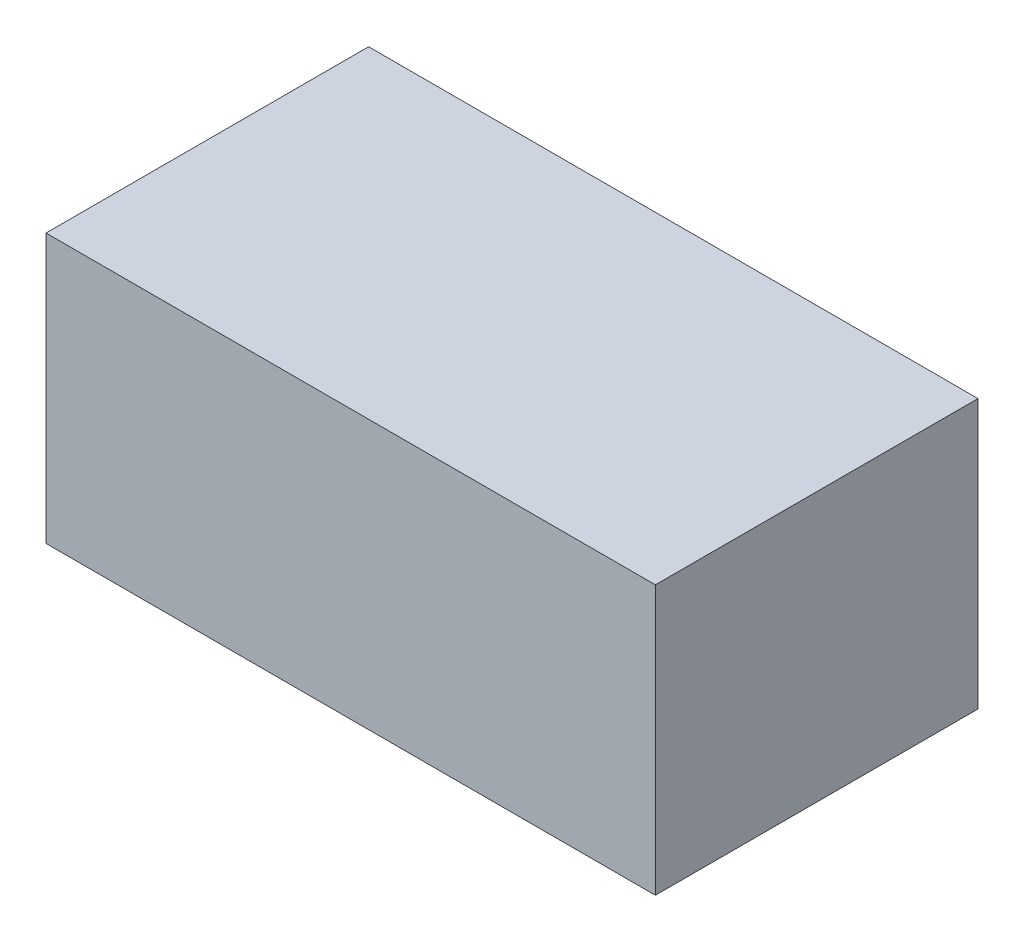
ISO-10303-21;
HEADER;
FILE_DESCRIPTION(('STEP AP214'),'2;1');
FILE_NAME('part.step','',(''),(''),'','','');
FILE_SCHEMA(('AUTOMOTIVE_DESIGN { 1 0 10303 214 1 1 1 1 }'));
ENDSEC;
DATA;
#1=APPLICATION_CONTEXT('core data for automotive mechanical design processes');
#2=APPLICATION_PROTOCOL_DEFINITION('international standard','automotive_design',2000,#1);
#3=PRODUCT_CONTEXT('',#1,'mechanical');
#4=PRODUCT('Part','Part','',(#3));
#5=PRODUCT_RELATED_PRODUCT_CATEGORY('part','',(#4));
#6=PRODUCT_DEFINITION_FORMATION('','',#4);
#7=PRODUCT_DEFINITION_CONTEXT('part definition',#1,'design');
#8=PRODUCT_DEFINITION('design','',#6,#7);
#9=PRODUCT_DEFINITION_SHAPE('','',#8);
#10=(LENGTH_UNIT() NAMED_UNIT(*) SI_UNIT(.MILLI.,.METRE.));
#11=(NAMED_UNIT(*) PLANE_ANGLE_UNIT() SI_UNIT($,.RADIAN.));
#12=(NAMED_UNIT(*) SI_UNIT($,.STERADIAN.) SOLID_ANGLE_UNIT());
#13=UNCERTAINTY_MEASURE_WITH_UNIT(LENGTH_MEASURE(1.E-05),#10,'distance_accuracy_value','');
#14=(GEOMETRIC_REPRESENTATION_CONTEXT(3) GLOBAL_UNCERTAINTY_ASSIGNED_CONTEXT((#13)) GLOBAL_UNIT_ASSIGNED_CONTEXT((#10,
#11,#12)) REPRESENTATION_CONTEXT('',''));
#15=CARTESIAN_POINT('',(0.,0.,0.));
#16=DIRECTION('',(0.,0.,1.));
#17=DIRECTION('',(1.,0.,0.));
#18=AXIS2_PLACEMENT_3D('',#15,#16,#17);
#19=CARTESIAN_POINT('',(0.,0.,0.9));
#20=DIRECTION('',(1.,0.,0.));
#21=DIRECTION('',(0.,0.,-1.));
#22=AXIS2_PLACEMENT_3D('',#19,#20,#21);
#23=PLANE('',#22);
#24=DIRECTION('',(0.,-1.,0.));
#25=VECTOR('',#24,1.);
#26=CARTESIAN_POINT('',(0.,0.,0.));
#27=LINE('',#26,#25);
#28=CARTESIAN_POINT('',(0.,0.75,0.));
#29=VERTEX_POINT('',#28);
#30=CARTESIAN_POINT('',(0.,0.,0.));
#31=VERTEX_POINT('',#30);
#32=EDGE_CURVE('E96',#29,#31,#27,.T.);
#33=ORIENTED_EDGE('',*,*,#32,.T.);
#34=DIRECTION('',(0.,0.,-1.));
#35=VECTOR('',#34,1.);
#36=CARTESIAN_POINT('',(0.,0.,0.9));
#37=LINE('',#36,#35);
#38=CARTESIAN_POINT('',(0.,0.,0.9));
#39=VERTEX_POINT('',#38);
#40=EDGE_CURVE('E11',#39,#31,#37,.T.);
#41=ORIENTED_EDGE('',*,*,#40,.F.);
#42=DIRECTION('',(0.,-1.,0.));
#43=VECTOR('',#42,1.);
#44=CARTESIAN_POINT('',(0.,0.,0.9));
#45=LINE('',#44,#43);
#46=CARTESIAN_POINT('',(0.,0.75,0.9));
#47=VERTEX_POINT('',#46);
#48=EDGE_CURVE('E84',#47,#39,#45,.T.);
#49=ORIENTED_EDGE('',*,*,#48,.F.);
#50=DIRECTION('',(0.,0.,-1.));
#51=VECTOR('',#50,1.);
#52=CARTESIAN_POINT('',(0.,0.75,0.9));
#53=LINE('',#52,#51);
#54=EDGE_CURVE('E92',#47,#29,#53,.T.);
#55=ORIENTED_EDGE('',*,*,#54,.T.);
#56=EDGE_LOOP('',(#33,#41,#49,#55));
#57=FACE_BOUND('',#56,.T.);
#58=ADVANCED_FACE('F33',(#57),#23,.F.);
#59=CARTESIAN_POINT('',(0.,0.,0.9));
#60=DIRECTION('',(0.,1.,0.));
#61=DIRECTION('',(0.,0.,1.));
#62=AXIS2_PLACEMENT_3D('',#59,#60,#61);
#63=PLANE('',#62);
#64=DIRECTION('',(1.,0.,0.));
#65=VECTOR('',#64,1.);
#66=CARTESIAN_POINT('',(0.,0.,0.));
#67=LINE('',#66,#65);
#68=CARTESIAN_POINT('',(1.7,0.,0.));
#69=VERTEX_POINT('',#68);
#70=EDGE_CURVE('E88',#31,#69,#67,.T.);
#71=ORIENTED_EDGE('',*,*,#70,.T.);
#72=DIRECTION('',(0.,0.,-1.));
#73=VECTOR('',#72,1.);
#74=CARTESIAN_POINT('',(1.7,0.,0.9));
#75=LINE('',#74,#73);
#76=CARTESIAN_POINT('',(1.7,0.,0.9));
#77=VERTEX_POINT('',#76);
#78=EDGE_CURVE('E41',#77,#69,#75,.T.);
#79=ORIENTED_EDGE('',*,*,#78,.F.);
#80=DIRECTION('',(1.,0.,0.));
#81=VECTOR('',#80,1.);
#82=CARTESIAN_POINT('',(0.,0.,0.9));
#83=LINE('',#82,#81);
#84=EDGE_CURVE('E79',#39,#77,#83,.T.);
#85=ORIENTED_EDGE('',*,*,#84,.F.);
#86=ORIENTED_EDGE('',*,*,#40,.T.);
#87=EDGE_LOOP('',(#71,#79,#85,#86));
#88=FACE_BOUND('',#87,.T.);
#89=ADVANCED_FACE('F87',(#88),#63,.F.);
#90=CARTESIAN_POINT('',(1.7,0.,0.9));
#91=DIRECTION('',(-1.,0.,0.));
#92=DIRECTION('',(0.,0.,1.));
#93=AXIS2_PLACEMENT_3D('',#90,#91,#92);
#94=PLANE('',#93);
#95=DIRECTION('',(0.,1.,0.));
#96=VECTOR('',#95,1.);
#97=CARTESIAN_POINT('',(1.7,0.,0.));
#98=LINE('',#97,#96);
#99=CARTESIAN_POINT('',(1.7,0.75,0.));
#100=VERTEX_POINT('',#99);
#101=EDGE_CURVE('E66',#69,#100,#98,.T.);
#102=ORIENTED_EDGE('',*,*,#101,.T.);
#103=DIRECTION('',(0.,0.,-1.));
#104=VECTOR('',#103,1.);
#105=CARTESIAN_POINT('',(1.7,0.75,0.9));
#106=LINE('',#105,#104);
#107=CARTESIAN_POINT('',(1.7,0.75,0.9));
#108=VERTEX_POINT('',#107);
#109=EDGE_CURVE('E89',#108,#100,#106,.T.);
#110=ORIENTED_EDGE('',*,*,#109,.F.);
#111=DIRECTION('',(0.,1.,0.));
#112=VECTOR('',#111,1.);
#113=CARTESIAN_POINT('',(1.7,0.,0.9));
#114=LINE('',#113,#112);
#115=EDGE_CURVE('E82',#77,#108,#114,.T.);
#116=ORIENTED_EDGE('',*,*,#115,.F.);
#117=ORIENTED_EDGE('',*,*,#78,.T.);
#118=EDGE_LOOP('',(#102,#110,#116,#117));
#119=FACE_BOUND('',#118,.T.);
#120=ADVANCED_FACE('F90',(#119),#94,.F.);
#121=CARTESIAN_POINT('',(0.,0.75,0.9));
#122=DIRECTION('',(0.,-1.,0.));
#123=DIRECTION('',(0.,0.,-1.));
#124=AXIS2_PLACEMENT_3D('',#121,#122,#123);
#125=PLANE('',#124);
#126=DIRECTION('',(-1.,0.,0.));
#127=VECTOR('',#126,1.);
#128=CARTESIAN_POINT('',(0.,0.75,0.));
#129=LINE('',#128,#127);
#130=EDGE_CURVE('E72',#100,#29,#129,.T.);
#131=ORIENTED_EDGE('',*,*,#130,.T.);
#132=ORIENTED_EDGE('',*,*,#54,.F.);
#133=DIRECTION('',(-1.,0.,0.));
#134=VECTOR('',#133,1.);
#135=CARTESIAN_POINT('',(0.,0.75,0.9));
#136=LINE('',#135,#134);
#137=EDGE_CURVE('E49',#108,#47,#136,.T.);
#138=ORIENTED_EDGE('',*,*,#137,.F.);
#139=ORIENTED_EDGE('',*,*,#109,.T.);
#140=EDGE_LOOP('',(#131,#132,#138,#139));
#141=FACE_BOUND('',#140,.T.);
#142=ADVANCED_FACE('F103',(#141),#125,.F.);
#143=CARTESIAN_POINT('',(0.,0.,0.9));
#144=DIRECTION('',(0.,0.,-1.));
#145=DIRECTION('',(-1.,0.,0.));
#146=AXIS2_PLACEMENT_3D('',#143,#144,#145);
#147=PLANE('',#146);
#148=ORIENTED_EDGE('',*,*,#48,.T.);
#149=ORIENTED_EDGE('',*,*,#84,.T.);
#150=ORIENTED_EDGE('',*,*,#115,.T.);
#151=ORIENTED_EDGE('',*,*,#137,.T.);
#152=EDGE_LOOP('',(#148,#149,#150,#151));
#153=FACE_BOUND('',#152,.T.);
#154=ADVANCED_FACE('F80',(#153),#147,.F.);
#155=CARTESIAN_POINT('',(0.,0.,0.));
#156=DIRECTION('',(0.,0.,-1.));
#157=DIRECTION('',(-1.,0.,0.));
#158=AXIS2_PLACEMENT_3D('',#155,#156,#157);
#159=PLANE('',#158);
#160=ORIENTED_EDGE('',*,*,#32,.F.);
#161=ORIENTED_EDGE('',*,*,#130,.F.);
#162=ORIENTED_EDGE('',*,*,#101,.F.);
#163=ORIENTED_EDGE('',*,*,#70,.F.);
#164=EDGE_LOOP('',(#160,#161,#162,#163));
#165=FACE_BOUND('',#164,.T.);
#166=ADVANCED_FACE('F106',(#165),#159,.T.);
#167=CLOSED_SHELL('',(#58,#89,#120,#142,#154,#166));
#168=MANIFOLD_SOLID_BREP('B2',#167);
#169=ADVANCED_BREP_SHAPE_REPRESENTATION('',(#18,#168),#14);
#170=SHAPE_DEFINITION_REPRESENTATION(#9,#169);
ENDSEC;
END-ISO-10303-21;
